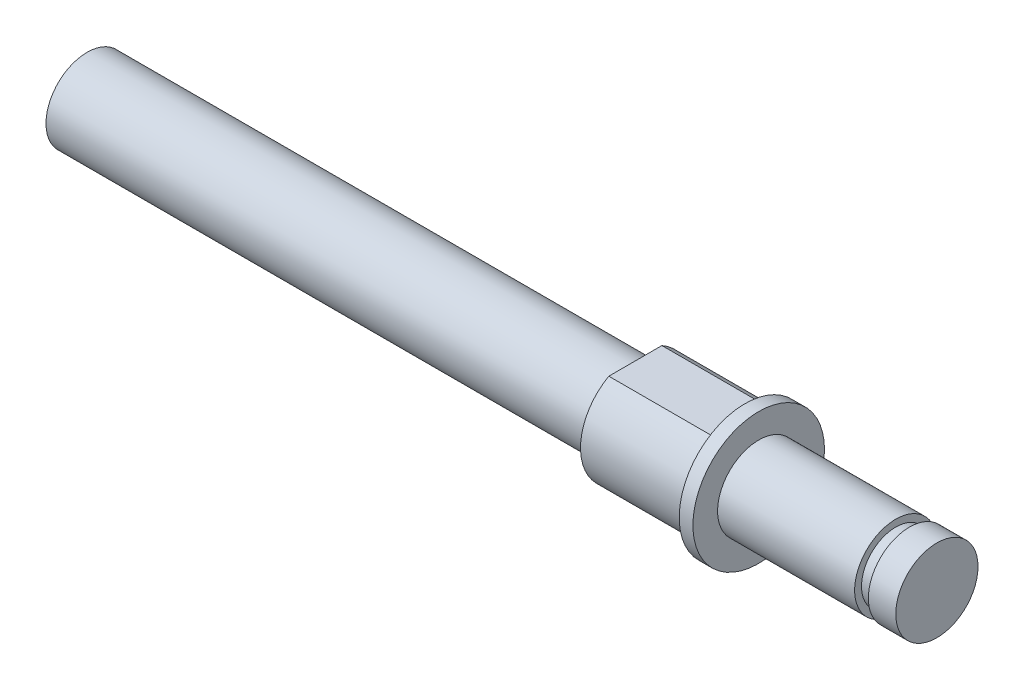
ISO-10303-21;
HEADER;
FILE_DESCRIPTION(('STEP AP214'),'2;1');
FILE_NAME('part.step','',(''),(''),'','','');
FILE_SCHEMA(('AUTOMOTIVE_DESIGN { 1 0 10303 214 1 1 1 1 }'));
ENDSEC;
DATA;
#1=APPLICATION_CONTEXT('core data for automotive mechanical design processes');
#2=APPLICATION_PROTOCOL_DEFINITION('international standard','automotive_design',2000,#1);
#3=PRODUCT_CONTEXT('',#1,'mechanical');
#4=PRODUCT('Part','Part','',(#3));
#5=PRODUCT_RELATED_PRODUCT_CATEGORY('part','',(#4));
#6=PRODUCT_DEFINITION_FORMATION('','',#4);
#7=PRODUCT_DEFINITION_CONTEXT('part definition',#1,'design');
#8=PRODUCT_DEFINITION('design','',#6,#7);
#9=PRODUCT_DEFINITION_SHAPE('','',#8);
#10=(LENGTH_UNIT() NAMED_UNIT(*) SI_UNIT(.MILLI.,.METRE.));
#11=(NAMED_UNIT(*) PLANE_ANGLE_UNIT() SI_UNIT($,.RADIAN.));
#12=(NAMED_UNIT(*) SI_UNIT($,.STERADIAN.) SOLID_ANGLE_UNIT());
#13=UNCERTAINTY_MEASURE_WITH_UNIT(LENGTH_MEASURE(1.E-05),#10,'distance_accuracy_value','');
#14=(GEOMETRIC_REPRESENTATION_CONTEXT(3) GLOBAL_UNCERTAINTY_ASSIGNED_CONTEXT((#13)) GLOBAL_UNIT_ASSIGNED_CONTEXT((#10,
#11,#12)) REPRESENTATION_CONTEXT('',''));
#15=CARTESIAN_POINT('',(0.,0.,0.));
#16=DIRECTION('',(0.,0.,1.));
#17=DIRECTION('',(1.,0.,0.));
#18=AXIS2_PLACEMENT_3D('',#15,#16,#17);
#19=CARTESIAN_POINT('',(31.,0.,0.));
#20=DIRECTION('',(-1.,0.,0.));
#21=DIRECTION('',(0.,0.,1.));
#22=AXIS2_PLACEMENT_3D('',#19,#20,#21);
#23=CYLINDRICAL_SURFACE('',#22,1.5);
#24=CARTESIAN_POINT('',(24.5,0.,0.));
#25=DIRECTION('',(1.,0.,0.));
#26=DIRECTION('',(0.,0.,-1.));
#27=AXIS2_PLACEMENT_3D('',#24,#25,#26);
#28=CIRCLE('',#27,1.5);
#29=CARTESIAN_POINT('',(24.5,0.,-1.5));
#30=VERTEX_POINT('',#29);
#31=EDGE_CURVE('E126',#30,#30,#28,.T.);
#32=ORIENTED_EDGE('',*,*,#31,.T.);
#33=EDGE_LOOP('',(#32));
#34=FACE_BOUND('',#33,.T.);
#35=CARTESIAN_POINT('',(29.5,0.,0.));
#36=DIRECTION('',(1.,0.,0.));
#37=DIRECTION('',(0.,0.,-1.));
#38=AXIS2_PLACEMENT_3D('',#35,#36,#37);
#39=CIRCLE('',#38,1.5);
#40=CARTESIAN_POINT('',(29.5,0.,-1.5));
#41=VERTEX_POINT('',#40);
#42=EDGE_CURVE('E122',#41,#41,#39,.T.);
#43=ORIENTED_EDGE('',*,*,#42,.F.);
#44=EDGE_LOOP('',(#43));
#45=FACE_BOUND('',#44,.T.);
#46=ADVANCED_FACE('F35',(#34,#45),#23,.T.);
#47=CARTESIAN_POINT('',(24.,0.,0.));
#48=DIRECTION('',(-1.,0.,0.));
#49=DIRECTION('',(0.,0.,1.));
#50=AXIS2_PLACEMENT_3D('',#47,#48,#49);
#51=CYLINDRICAL_SURFACE('',#50,2.);
#52=CARTESIAN_POINT('',(20.,0.,0.));
#53=DIRECTION('',(-1.,0.,0.));
#54=DIRECTION('',(0.,0.,1.));
#55=AXIS2_PLACEMENT_3D('',#52,#53,#54);
#56=CIRCLE('',#55,2.);
#57=CARTESIAN_POINT('',(20.,1.75,-0.968245836551854));
#58=VERTEX_POINT('',#57);
#59=CARTESIAN_POINT('',(20.,1.75,0.968245836551854));
#60=VERTEX_POINT('',#59);
#61=EDGE_CURVE('E76',#58,#60,#56,.T.);
#62=ORIENTED_EDGE('',*,*,#61,.F.);
#63=DIRECTION('',(-1.,0.,0.));
#64=VECTOR('',#63,1.);
#65=CARTESIAN_POINT('',(24.,1.75,-0.968245836551854));
#66=LINE('',#65,#64);
#67=CARTESIAN_POINT('',(24.,1.75,-0.968245836551854));
#68=VERTEX_POINT('',#67);
#69=EDGE_CURVE('E72',#68,#58,#66,.T.);
#70=ORIENTED_EDGE('',*,*,#69,.F.);
#71=CARTESIAN_POINT('',(24.,0.,0.));
#72=DIRECTION('',(-1.,0.,0.));
#73=DIRECTION('',(0.,0.,1.));
#74=AXIS2_PLACEMENT_3D('',#71,#72,#73);
#75=CIRCLE('',#74,2.);
#76=CARTESIAN_POINT('',(24.,1.75,0.968245836551854));
#77=VERTEX_POINT('',#76);
#78=EDGE_CURVE('E50',#68,#77,#75,.T.);
#79=ORIENTED_EDGE('',*,*,#78,.T.);
#80=DIRECTION('',(-1.,0.,0.));
#81=VECTOR('',#80,1.);
#82=CARTESIAN_POINT('',(24.,1.75,0.968245836551854));
#83=LINE('',#82,#81);
#84=EDGE_CURVE('E60',#77,#60,#83,.T.);
#85=ORIENTED_EDGE('',*,*,#84,.T.);
#86=EDGE_LOOP('',(#62,#70,#79,#85));
#87=FACE_BOUND('',#86,.T.);
#88=ADVANCED_FACE('F74',(#87),#51,.T.);
#89=CARTESIAN_POINT('',(24.,1.75,0.968245836551854));
#90=DIRECTION('',(0.,1.,0.));
#91=DIRECTION('',(0.,0.,1.));
#92=AXIS2_PLACEMENT_3D('',#89,#90,#91);
#93=PLANE('',#92);
#94=DIRECTION('',(0.,0.,-1.));
#95=VECTOR('',#94,1.);
#96=CARTESIAN_POINT('',(20.,1.75,0.968245836551854));
#97=LINE('',#96,#95);
#98=EDGE_CURVE('E71',#60,#58,#97,.T.);
#99=ORIENTED_EDGE('',*,*,#98,.F.);
#100=ORIENTED_EDGE('',*,*,#84,.F.);
#101=DIRECTION('',(0.,0.,-1.));
#102=VECTOR('',#101,1.);
#103=CARTESIAN_POINT('',(24.,1.75,0.968245836551854));
#104=LINE('',#103,#102);
#105=EDGE_CURVE('E63',#77,#68,#104,.T.);
#106=ORIENTED_EDGE('',*,*,#105,.T.);
#107=ORIENTED_EDGE('',*,*,#69,.T.);
#108=EDGE_LOOP('',(#99,#100,#106,#107));
#109=FACE_BOUND('',#108,.T.);
#110=ADVANCED_FACE('F69',(#109),#93,.T.);
#111=CARTESIAN_POINT('',(20.,0.,0.));
#112=DIRECTION('',(-1.,0.,0.));
#113=DIRECTION('',(0.,0.,1.));
#114=AXIS2_PLACEMENT_3D('',#111,#112,#113);
#115=PLANE('',#114);
#116=CARTESIAN_POINT('',(20.,0.,0.));
#117=DIRECTION('',(-1.,0.,0.));
#118=DIRECTION('',(0.,0.,1.));
#119=AXIS2_PLACEMENT_3D('',#116,#117,#118);
#120=CIRCLE('',#119,1.5);
#121=CARTESIAN_POINT('',(20.,0.,1.5));
#122=VERTEX_POINT('',#121);
#123=EDGE_CURVE('E79',#122,#122,#120,.T.);
#124=ORIENTED_EDGE('',*,*,#123,.F.);
#125=EDGE_LOOP('',(#124));
#126=FACE_BOUND('',#125,.T.);
#127=ORIENTED_EDGE('',*,*,#61,.T.);
#128=ORIENTED_EDGE('',*,*,#98,.T.);
#129=EDGE_LOOP('',(#127,#128));
#130=FACE_BOUND('',#129,.T.);
#131=ADVANCED_FACE('F89',(#126,#130),#115,.T.);
#132=CARTESIAN_POINT('',(0.,0.,0.));
#133=DIRECTION('',(1.,0.,0.));
#134=DIRECTION('',(0.,0.,-1.));
#135=AXIS2_PLACEMENT_3D('',#132,#133,#134);
#136=PLANE('',#135);
#137=CARTESIAN_POINT('',(0.,0.,0.));
#138=DIRECTION('',(1.,0.,0.));
#139=DIRECTION('',(0.,0.,-1.));
#140=AXIS2_PLACEMENT_3D('',#137,#138,#139);
#141=CIRCLE('',#140,1.5);
#142=CARTESIAN_POINT('',(0.,0.,-1.5));
#143=VERTEX_POINT('',#142);
#144=EDGE_CURVE('E39',#143,#143,#141,.T.);
#145=ORIENTED_EDGE('',*,*,#144,.F.);
#146=EDGE_LOOP('',(#145));
#147=FACE_BOUND('',#146,.T.);
#148=ADVANCED_FACE('F87',(#147),#136,.F.);
#149=ORIENTED_EDGE('',*,*,#123,.T.);
#150=EDGE_LOOP('',(#149));
#151=FACE_BOUND('',#150,.T.);
#152=ORIENTED_EDGE('',*,*,#144,.T.);
#153=EDGE_LOOP('',(#152));
#154=FACE_BOUND('',#153,.T.);
#155=ADVANCED_FACE('F37',(#151,#154),#23,.T.);
#156=CARTESIAN_POINT('',(24.5,0.,0.));
#157=DIRECTION('',(1.,0.,0.));
#158=DIRECTION('',(0.,0.,-1.));
#159=AXIS2_PLACEMENT_3D('',#156,#157,#158);
#160=PLANE('',#159);
#161=CARTESIAN_POINT('',(24.5,0.,0.));
#162=DIRECTION('',(1.,0.,0.));
#163=DIRECTION('',(0.,0.,-1.));
#164=AXIS2_PLACEMENT_3D('',#161,#162,#163);
#165=CIRCLE('',#164,2.4);
#166=CARTESIAN_POINT('',(24.5,0.,-2.4));
#167=VERTEX_POINT('',#166);
#168=EDGE_CURVE('E135',#167,#167,#165,.T.);
#169=ORIENTED_EDGE('',*,*,#168,.T.);
#170=EDGE_LOOP('',(#169));
#171=FACE_BOUND('',#170,.T.);
#172=ORIENTED_EDGE('',*,*,#31,.F.);
#173=EDGE_LOOP('',(#172));
#174=FACE_BOUND('',#173,.T.);
#175=ADVANCED_FACE('F94',(#171,#174),#160,.T.);
#176=CARTESIAN_POINT('',(24.,0.,0.));
#177=DIRECTION('',(1.,0.,0.));
#178=DIRECTION('',(0.,0.,-1.));
#179=AXIS2_PLACEMENT_3D('',#176,#177,#178);
#180=PLANE('',#179);
#181=ORIENTED_EDGE('',*,*,#78,.F.);
#182=ORIENTED_EDGE('',*,*,#105,.F.);
#183=EDGE_LOOP('',(#181,#182));
#184=FACE_BOUND('',#183,.T.);
#185=CARTESIAN_POINT('',(24.,0.,0.));
#186=DIRECTION('',(1.,0.,0.));
#187=DIRECTION('',(0.,0.,-1.));
#188=AXIS2_PLACEMENT_3D('',#185,#186,#187);
#189=CIRCLE('',#188,2.4);
#190=CARTESIAN_POINT('',(24.,0.,-2.4));
#191=VERTEX_POINT('',#190);
#192=EDGE_CURVE('E134',#191,#191,#189,.T.);
#193=ORIENTED_EDGE('',*,*,#192,.F.);
#194=EDGE_LOOP('',(#193));
#195=FACE_BOUND('',#194,.T.);
#196=ADVANCED_FACE('F64',(#184,#195),#180,.F.);
#197=CARTESIAN_POINT('',(24.5,0.,0.));
#198=DIRECTION('',(-1.,0.,0.));
#199=DIRECTION('',(0.,0.,1.));
#200=AXIS2_PLACEMENT_3D('',#197,#198,#199);
#201=CYLINDRICAL_SURFACE('',#200,2.4);
#202=ORIENTED_EDGE('',*,*,#168,.F.);
#203=EDGE_LOOP('',(#202));
#204=FACE_BOUND('',#203,.T.);
#205=ORIENTED_EDGE('',*,*,#192,.T.);
#206=EDGE_LOOP('',(#205));
#207=FACE_BOUND('',#206,.T.);
#208=ADVANCED_FACE('F140',(#204,#207),#201,.T.);
#209=CARTESIAN_POINT('',(29.5,0.,0.));
#210=DIRECTION('',(1.,0.,0.));
#211=DIRECTION('',(0.,0.,-1.));
#212=AXIS2_PLACEMENT_3D('',#209,#210,#211);
#213=PLANE('',#212);
#214=CARTESIAN_POINT('',(29.5,0.,0.));
#215=DIRECTION('',(1.,0.,0.));
#216=DIRECTION('',(0.,0.,-1.));
#217=AXIS2_PLACEMENT_3D('',#214,#215,#216);
#218=CIRCLE('',#217,1.25);
#219=CARTESIAN_POINT('',(29.5,0.,-1.25));
#220=VERTEX_POINT('',#219);
#221=EDGE_CURVE('E123',#220,#220,#218,.T.);
#222=ORIENTED_EDGE('',*,*,#221,.F.);
#223=EDGE_LOOP('',(#222));
#224=FACE_BOUND('',#223,.T.);
#225=ORIENTED_EDGE('',*,*,#42,.T.);
#226=EDGE_LOOP('',(#225));
#227=FACE_BOUND('',#226,.T.);
#228=ADVANCED_FACE('F147',(#224,#227),#213,.T.);
#229=CARTESIAN_POINT('',(30.,0.,0.));
#230=DIRECTION('',(1.,0.,0.));
#231=DIRECTION('',(0.,0.,-1.));
#232=AXIS2_PLACEMENT_3D('',#229,#230,#231);
#233=PLANE('',#232);
#234=CARTESIAN_POINT('',(30.,0.,0.));
#235=DIRECTION('',(1.,0.,0.));
#236=DIRECTION('',(0.,0.,-1.));
#237=AXIS2_PLACEMENT_3D('',#234,#235,#236);
#238=CIRCLE('',#237,1.25);
#239=CARTESIAN_POINT('',(30.,0.,-1.25));
#240=VERTEX_POINT('',#239);
#241=EDGE_CURVE('E129',#240,#240,#238,.T.);
#242=ORIENTED_EDGE('',*,*,#241,.T.);
#243=EDGE_LOOP('',(#242));
#244=FACE_BOUND('',#243,.T.);
#245=CARTESIAN_POINT('',(30.,0.,0.));
#246=DIRECTION('',(1.,0.,0.));
#247=DIRECTION('',(0.,0.,-1.));
#248=AXIS2_PLACEMENT_3D('',#245,#246,#247);
#249=CIRCLE('',#248,1.5);
#250=CARTESIAN_POINT('',(30.,0.,-1.5));
#251=VERTEX_POINT('',#250);
#252=EDGE_CURVE('E119',#251,#251,#249,.T.);
#253=ORIENTED_EDGE('',*,*,#252,.F.);
#254=EDGE_LOOP('',(#253));
#255=FACE_BOUND('',#254,.T.);
#256=ADVANCED_FACE('F199',(#244,#255),#233,.F.);
#257=CARTESIAN_POINT('',(29.5,0.,0.));
#258=DIRECTION('',(1.,0.,0.));
#259=DIRECTION('',(0.,0.,-1.));
#260=AXIS2_PLACEMENT_3D('',#257,#258,#259);
#261=CYLINDRICAL_SURFACE('',#260,1.25);
#262=ORIENTED_EDGE('',*,*,#221,.T.);
#263=EDGE_LOOP('',(#262));
#264=FACE_BOUND('',#263,.T.);
#265=ORIENTED_EDGE('',*,*,#241,.F.);
#266=EDGE_LOOP('',(#265));
#267=FACE_BOUND('',#266,.T.);
#268=ADVANCED_FACE('F114',(#264,#267),#261,.T.);
#269=CARTESIAN_POINT('',(31.,0.,0.));
#270=DIRECTION('',(1.,0.,0.));
#271=DIRECTION('',(0.,0.,-1.));
#272=AXIS2_PLACEMENT_3D('',#269,#270,#271);
#273=PLANE('',#272);
#274=CARTESIAN_POINT('',(31.,0.,0.));
#275=DIRECTION('',(1.,0.,0.));
#276=DIRECTION('',(0.,0.,-1.));
#277=AXIS2_PLACEMENT_3D('',#274,#275,#276);
#278=CIRCLE('',#277,1.5);
#279=CARTESIAN_POINT('',(31.,0.,-1.5));
#280=VERTEX_POINT('',#279);
#281=EDGE_CURVE('E11',#280,#280,#278,.T.);
#282=ORIENTED_EDGE('',*,*,#281,.T.);
#283=EDGE_LOOP('',(#282));
#284=FACE_BOUND('',#283,.T.);
#285=ADVANCED_FACE('F109',(#284),#273,.T.);
#286=ORIENTED_EDGE('',*,*,#252,.T.);
#287=EDGE_LOOP('',(#286));
#288=FACE_BOUND('',#287,.T.);
#289=ORIENTED_EDGE('',*,*,#281,.F.);
#290=EDGE_LOOP('',(#289));
#291=FACE_BOUND('',#290,.T.);
#292=ADVANCED_FACE('F96',(#288,#291),#23,.T.);
#293=CLOSED_SHELL('',(#46,#88,#110,#131,#148,#155,#175,#196,#208,#228,#256,#268,#285,#292));
#294=MANIFOLD_SOLID_BREP('B2',#293);
#295=ADVANCED_BREP_SHAPE_REPRESENTATION('',(#18,#294),#14);
#296=SHAPE_DEFINITION_REPRESENTATION(#9,#295);
ENDSEC;
END-ISO-10303-21;
